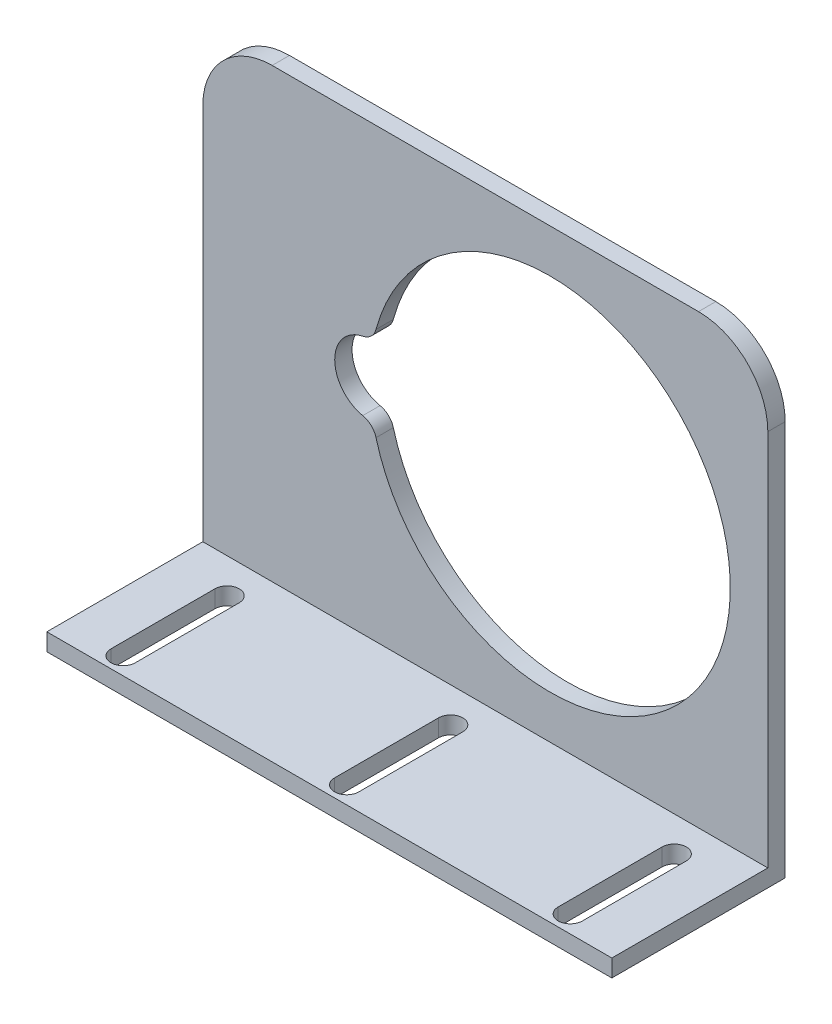
ISO-10303-21;
HEADER;
FILE_DESCRIPTION(('STEP AP214'),'2;1');
FILE_NAME('part.step','',(''),(''),'','','');
FILE_SCHEMA(('AUTOMOTIVE_DESIGN { 1 0 10303 214 1 1 1 1 }'));
ENDSEC;
DATA;
#1=APPLICATION_CONTEXT('core data for automotive mechanical design processes');
#2=APPLICATION_PROTOCOL_DEFINITION('international standard','automotive_design',2000,#1);
#3=PRODUCT_CONTEXT('',#1,'mechanical');
#4=PRODUCT('Part','Part','',(#3));
#5=PRODUCT_RELATED_PRODUCT_CATEGORY('part','',(#4));
#6=PRODUCT_DEFINITION_FORMATION('','',#4);
#7=PRODUCT_DEFINITION_CONTEXT('part definition',#1,'design');
#8=PRODUCT_DEFINITION('design','',#6,#7);
#9=PRODUCT_DEFINITION_SHAPE('','',#8);
#10=(LENGTH_UNIT() NAMED_UNIT(*) SI_UNIT(.MILLI.,.METRE.));
#11=(NAMED_UNIT(*) PLANE_ANGLE_UNIT() SI_UNIT($,.RADIAN.));
#12=(NAMED_UNIT(*) SI_UNIT($,.STERADIAN.) SOLID_ANGLE_UNIT());
#13=UNCERTAINTY_MEASURE_WITH_UNIT(LENGTH_MEASURE(1.E-05),#10,'distance_accuracy_value','');
#14=(GEOMETRIC_REPRESENTATION_CONTEXT(3) GLOBAL_UNCERTAINTY_ASSIGNED_CONTEXT((#13)) GLOBAL_UNIT_ASSIGNED_CONTEXT((#10,
#11,#12)) REPRESENTATION_CONTEXT('',''));
#15=CARTESIAN_POINT('',(0.,0.,0.));
#16=DIRECTION('',(0.,0.,1.));
#17=DIRECTION('',(1.,0.,0.));
#18=AXIS2_PLACEMENT_3D('',#15,#16,#17);
#19=CARTESIAN_POINT('',(0.,5.,0.));
#20=DIRECTION('',(0.,1.,0.));
#21=DIRECTION('',(0.,0.,1.));
#22=AXIS2_PLACEMENT_3D('',#19,#20,#21);
#23=PLANE('',#22);
#24=CARTESIAN_POINT('',(0.,5.,-10.));
#25=DIRECTION('',(0.,1.,0.));
#26=DIRECTION('',(0.,0.,1.));
#27=AXIS2_PLACEMENT_3D('',#24,#25,#26);
#28=CIRCLE('',#27,3.5);
#29=CARTESIAN_POINT('',(3.49999999999999,5.,-10.));
#30=VERTEX_POINT('',#29);
#31=CARTESIAN_POINT('',(-3.50000000000001,5.,-9.99999999999999));
#32=VERTEX_POINT('',#31);
#33=EDGE_CURVE('E59',#30,#32,#28,.T.);
#34=ORIENTED_EDGE('',*,*,#33,.F.);
#35=DIRECTION('',(0.,0.,-1.));
#36=VECTOR('',#35,1.);
#37=CARTESIAN_POINT('',(3.49999999999999,5.,-10.));
#38=LINE('',#37,#36);
#39=CARTESIAN_POINT('',(3.5,5.,20.));
#40=VERTEX_POINT('',#39);
#41=EDGE_CURVE('E225',#40,#30,#38,.T.);
#42=ORIENTED_EDGE('',*,*,#41,.F.);
#43=CARTESIAN_POINT('',(0.,5.,20.));
#44=DIRECTION('',(0.,1.,0.));
#45=DIRECTION('',(0.,0.,1.));
#46=AXIS2_PLACEMENT_3D('',#43,#44,#45);
#47=CIRCLE('',#46,3.5);
#48=CARTESIAN_POINT('',(-3.5,5.,20.));
#49=VERTEX_POINT('',#48);
#50=EDGE_CURVE('E229',#49,#40,#47,.T.);
#51=ORIENTED_EDGE('',*,*,#50,.F.);
#52=DIRECTION('',(0.,0.,1.));
#53=VECTOR('',#52,1.);
#54=CARTESIAN_POINT('',(-3.50000000000001,5.,-9.99999999999999));
#55=LINE('',#54,#53);
#56=EDGE_CURVE('E238',#32,#49,#55,.T.);
#57=ORIENTED_EDGE('',*,*,#56,.F.);
#58=EDGE_LOOP('',(#34,#42,#51,#57));
#59=FACE_BOUND('',#58,.T.);
#60=CARTESIAN_POINT('',(-64.5,5.,-9.99999999999999));
#61=DIRECTION('',(0.,1.,0.));
#62=DIRECTION('',(0.,0.,1.));
#63=AXIS2_PLACEMENT_3D('',#60,#61,#62);
#64=CIRCLE('',#63,3.5);
#65=CARTESIAN_POINT('',(-61.,5.,-9.99999999999999));
#66=VERTEX_POINT('',#65);
#67=CARTESIAN_POINT('',(-68.,5.,-9.99999999999999));
#68=VERTEX_POINT('',#67);
#69=EDGE_CURVE('E286',#66,#68,#64,.T.);
#70=ORIENTED_EDGE('',*,*,#69,.F.);
#71=DIRECTION('',(0.,0.,-1.));
#72=VECTOR('',#71,1.);
#73=CARTESIAN_POINT('',(-61.,5.,-9.99999999999999));
#74=LINE('',#73,#72);
#75=CARTESIAN_POINT('',(-61.,5.,20.));
#76=VERTEX_POINT('',#75);
#77=EDGE_CURVE('E301',#76,#66,#74,.T.);
#78=ORIENTED_EDGE('',*,*,#77,.F.);
#79=CARTESIAN_POINT('',(-64.5,5.,20.));
#80=DIRECTION('',(0.,1.,0.));
#81=DIRECTION('',(0.,0.,1.));
#82=AXIS2_PLACEMENT_3D('',#79,#80,#81);
#83=CIRCLE('',#82,3.5);
#84=CARTESIAN_POINT('',(-68.,5.,20.));
#85=VERTEX_POINT('',#84);
#86=EDGE_CURVE('E320',#85,#76,#83,.T.);
#87=ORIENTED_EDGE('',*,*,#86,.F.);
#88=DIRECTION('',(0.,0.,1.));
#89=VECTOR('',#88,1.);
#90=CARTESIAN_POINT('',(-68.,5.,-9.99999999999999));
#91=LINE('',#90,#89);
#92=EDGE_CURVE('E316',#68,#85,#91,.T.);
#93=ORIENTED_EDGE('',*,*,#92,.F.);
#94=EDGE_LOOP('',(#70,#78,#87,#93));
#95=FACE_BOUND('',#94,.T.);
#96=DIRECTION('',(1.,0.,0.));
#97=VECTOR('',#96,1.);
#98=CARTESIAN_POINT('',(-81.5,5.,-20.));
#99=LINE('',#98,#97);
#100=CARTESIAN_POINT('',(-81.5,5.,-20.));
#101=VERTEX_POINT('',#100);
#102=CARTESIAN_POINT('',(81.5,5.,-20.));
#103=VERTEX_POINT('',#102);
#104=EDGE_CURVE('E349',#101,#103,#99,.T.);
#105=ORIENTED_EDGE('',*,*,#104,.F.);
#106=DIRECTION('',(0.,0.,1.));
#107=VECTOR('',#106,1.);
#108=CARTESIAN_POINT('',(-81.5,5.,-25.));
#109=LINE('',#108,#107);
#110=CARTESIAN_POINT('',(-81.5,5.,25.));
#111=VERTEX_POINT('',#110);
#112=EDGE_CURVE('E378',#101,#111,#109,.T.);
#113=ORIENTED_EDGE('',*,*,#112,.T.);
#114=DIRECTION('',(1.,0.,0.));
#115=VECTOR('',#114,1.);
#116=CARTESIAN_POINT('',(-81.5,5.,25.));
#117=LINE('',#116,#115);
#118=CARTESIAN_POINT('',(81.5,5.,25.));
#119=VERTEX_POINT('',#118);
#120=EDGE_CURVE('E382',#111,#119,#117,.T.);
#121=ORIENTED_EDGE('',*,*,#120,.T.);
#122=DIRECTION('',(0.,0.,-1.));
#123=VECTOR('',#122,1.);
#124=CARTESIAN_POINT('',(81.5,5.,-25.));
#125=LINE('',#124,#123);
#126=EDGE_CURVE('E374',#119,#103,#125,.T.);
#127=ORIENTED_EDGE('',*,*,#126,.T.);
#128=EDGE_LOOP('',(#105,#113,#121,#127));
#129=FACE_BOUND('',#128,.T.);
#130=DIRECTION('',(0.,0.,-1.));
#131=VECTOR('',#130,1.);
#132=CARTESIAN_POINT('',(61.,5.,-9.99999999999999));
#133=LINE('',#132,#131);
#134=CARTESIAN_POINT('',(61.,5.,20.));
#135=VERTEX_POINT('',#134);
#136=CARTESIAN_POINT('',(61.,5.,-9.99999999999999));
#137=VERTEX_POINT('',#136);
#138=EDGE_CURVE('E271',#135,#137,#133,.T.);
#139=ORIENTED_EDGE('',*,*,#138,.T.);
#140=CARTESIAN_POINT('',(64.5,5.,-9.99999999999999));
#141=DIRECTION('',(0.,-1.,0.));
#142=DIRECTION('',(0.,0.,1.));
#143=AXIS2_PLACEMENT_3D('',#140,#141,#142);
#144=CIRCLE('',#143,3.5);
#145=CARTESIAN_POINT('',(68.,5.,-9.99999999999999));
#146=VERTEX_POINT('',#145);
#147=EDGE_CURVE('E247',#137,#146,#144,.T.);
#148=ORIENTED_EDGE('',*,*,#147,.T.);
#149=DIRECTION('',(0.,0.,1.));
#150=VECTOR('',#149,1.);
#151=CARTESIAN_POINT('',(68.,5.,-9.99999999999999));
#152=LINE('',#151,#150);
#153=CARTESIAN_POINT('',(68.,5.,20.));
#154=VERTEX_POINT('',#153);
#155=EDGE_CURVE('E257',#146,#154,#152,.T.);
#156=ORIENTED_EDGE('',*,*,#155,.T.);
#157=CARTESIAN_POINT('',(64.5,5.,20.));
#158=DIRECTION('',(0.,-1.,0.));
#159=DIRECTION('',(0.,0.,1.));
#160=AXIS2_PLACEMENT_3D('',#157,#158,#159);
#161=CIRCLE('',#160,3.5);
#162=EDGE_CURVE('E275',#154,#135,#161,.T.);
#163=ORIENTED_EDGE('',*,*,#162,.T.);
#164=EDGE_LOOP('',(#139,#148,#156,#163));
#165=FACE_BOUND('',#164,.T.);
#166=ADVANCED_FACE('F43',(#59,#95,#129,#165),#23,.T.);
#167=CARTESIAN_POINT('',(0.,0.,0.));
#168=DIRECTION('',(0.,1.,0.));
#169=DIRECTION('',(0.,0.,1.));
#170=AXIS2_PLACEMENT_3D('',#167,#168,#169);
#171=PLANE('',#170);
#172=DIRECTION('',(0.,0.,-1.));
#173=VECTOR('',#172,1.);
#174=CARTESIAN_POINT('',(3.49999999999999,0.,-10.));
#175=LINE('',#174,#173);
#176=CARTESIAN_POINT('',(3.5,0.,20.));
#177=VERTEX_POINT('',#176);
#178=CARTESIAN_POINT('',(3.49999999999999,0.,-10.));
#179=VERTEX_POINT('',#178);
#180=EDGE_CURVE('E213',#177,#179,#175,.T.);
#181=ORIENTED_EDGE('',*,*,#180,.T.);
#182=CARTESIAN_POINT('',(0.,0.,-10.));
#183=DIRECTION('',(0.,1.,0.));
#184=DIRECTION('',(0.,0.,1.));
#185=AXIS2_PLACEMENT_3D('',#182,#183,#184);
#186=CIRCLE('',#185,3.5);
#187=CARTESIAN_POINT('',(-3.50000000000001,0.,-9.99999999999999));
#188=VERTEX_POINT('',#187);
#189=EDGE_CURVE('E206',#179,#188,#186,.T.);
#190=ORIENTED_EDGE('',*,*,#189,.T.);
#191=DIRECTION('',(0.,0.,1.));
#192=VECTOR('',#191,1.);
#193=CARTESIAN_POINT('',(-3.50000000000001,0.,-9.99999999999999));
#194=LINE('',#193,#192);
#195=CARTESIAN_POINT('',(-3.5,0.,20.));
#196=VERTEX_POINT('',#195);
#197=EDGE_CURVE('E216',#188,#196,#194,.T.);
#198=ORIENTED_EDGE('',*,*,#197,.T.);
#199=CARTESIAN_POINT('',(0.,0.,20.));
#200=DIRECTION('',(0.,1.,0.));
#201=DIRECTION('',(0.,0.,1.));
#202=AXIS2_PLACEMENT_3D('',#199,#200,#201);
#203=CIRCLE('',#202,3.5);
#204=EDGE_CURVE('E67',#196,#177,#203,.T.);
#205=ORIENTED_EDGE('',*,*,#204,.T.);
#206=EDGE_LOOP('',(#181,#190,#198,#205));
#207=FACE_BOUND('',#206,.T.);
#208=DIRECTION('',(0.,0.,-1.));
#209=VECTOR('',#208,1.);
#210=CARTESIAN_POINT('',(81.5,0.,-25.));
#211=LINE('',#210,#209);
#212=CARTESIAN_POINT('',(81.5,0.,25.));
#213=VERTEX_POINT('',#212);
#214=CARTESIAN_POINT('',(81.5,0.,-25.));
#215=VERTEX_POINT('',#214);
#216=EDGE_CURVE('E373',#213,#215,#211,.T.);
#217=ORIENTED_EDGE('',*,*,#216,.F.);
#218=DIRECTION('',(1.,0.,0.));
#219=VECTOR('',#218,1.);
#220=CARTESIAN_POINT('',(-81.5,0.,25.));
#221=LINE('',#220,#219);
#222=CARTESIAN_POINT('',(-81.5,0.,25.));
#223=VERTEX_POINT('',#222);
#224=EDGE_CURVE('E379',#223,#213,#221,.T.);
#225=ORIENTED_EDGE('',*,*,#224,.F.);
#226=DIRECTION('',(0.,0.,1.));
#227=VECTOR('',#226,1.);
#228=CARTESIAN_POINT('',(-81.5,0.,-25.));
#229=LINE('',#228,#227);
#230=CARTESIAN_POINT('',(-81.5,0.,-25.));
#231=VERTEX_POINT('',#230);
#232=EDGE_CURVE('E393',#231,#223,#229,.T.);
#233=ORIENTED_EDGE('',*,*,#232,.F.);
#234=DIRECTION('',(-1.,0.,0.));
#235=VECTOR('',#234,1.);
#236=CARTESIAN_POINT('',(-81.5,0.,-25.));
#237=LINE('',#236,#235);
#238=EDGE_CURVE('E389',#215,#231,#237,.T.);
#239=ORIENTED_EDGE('',*,*,#238,.F.);
#240=EDGE_LOOP('',(#217,#225,#233,#239));
#241=FACE_BOUND('',#240,.T.);
#242=DIRECTION('',(0.,0.,-1.));
#243=VECTOR('',#242,1.);
#244=CARTESIAN_POINT('',(-61.,0.,-9.99999999999999));
#245=LINE('',#244,#243);
#246=CARTESIAN_POINT('',(-61.,0.,20.));
#247=VERTEX_POINT('',#246);
#248=CARTESIAN_POINT('',(-61.,0.,-9.99999999999999));
#249=VERTEX_POINT('',#248);
#250=EDGE_CURVE('E309',#247,#249,#245,.T.);
#251=ORIENTED_EDGE('',*,*,#250,.T.);
#252=CARTESIAN_POINT('',(-64.5,0.,-9.99999999999999));
#253=DIRECTION('',(0.,1.,0.));
#254=DIRECTION('',(0.,0.,1.));
#255=AXIS2_PLACEMENT_3D('',#252,#253,#254);
#256=CIRCLE('',#255,3.5);
#257=CARTESIAN_POINT('',(-68.,0.,-9.99999999999999));
#258=VERTEX_POINT('',#257);
#259=EDGE_CURVE('E296',#249,#258,#256,.T.);
#260=ORIENTED_EDGE('',*,*,#259,.T.);
#261=DIRECTION('',(0.,0.,1.));
#262=VECTOR('',#261,1.);
#263=CARTESIAN_POINT('',(-68.,0.,-9.99999999999999));
#264=LINE('',#263,#262);
#265=CARTESIAN_POINT('',(-68.,0.,20.));
#266=VERTEX_POINT('',#265);
#267=EDGE_CURVE('E300',#258,#266,#264,.T.);
#268=ORIENTED_EDGE('',*,*,#267,.T.);
#269=CARTESIAN_POINT('',(-64.5,0.,20.));
#270=DIRECTION('',(0.,1.,0.));
#271=DIRECTION('',(0.,0.,1.));
#272=AXIS2_PLACEMENT_3D('',#269,#270,#271);
#273=CIRCLE('',#272,3.5);
#274=EDGE_CURVE('E305',#266,#247,#273,.T.);
#275=ORIENTED_EDGE('',*,*,#274,.T.);
#276=EDGE_LOOP('',(#251,#260,#268,#275));
#277=FACE_BOUND('',#276,.T.);
#278=CARTESIAN_POINT('',(64.5,0.,-9.99999999999999));
#279=DIRECTION('',(0.,-1.,0.));
#280=DIRECTION('',(0.,0.,1.));
#281=AXIS2_PLACEMENT_3D('',#278,#279,#280);
#282=CIRCLE('',#281,3.5);
#283=CARTESIAN_POINT('',(61.,0.,-9.99999999999999));
#284=VERTEX_POINT('',#283);
#285=CARTESIAN_POINT('',(68.,0.,-9.99999999999999));
#286=VERTEX_POINT('',#285);
#287=EDGE_CURVE('E253',#284,#286,#282,.T.);
#288=ORIENTED_EDGE('',*,*,#287,.F.);
#289=DIRECTION('',(0.,0.,-1.));
#290=VECTOR('',#289,1.);
#291=CARTESIAN_POINT('',(61.,0.,-9.99999999999999));
#292=LINE('',#291,#290);
#293=CARTESIAN_POINT('',(61.,0.,20.));
#294=VERTEX_POINT('',#293);
#295=EDGE_CURVE('E256',#294,#284,#292,.T.);
#296=ORIENTED_EDGE('',*,*,#295,.F.);
#297=CARTESIAN_POINT('',(64.5,0.,20.));
#298=DIRECTION('',(0.,-1.,0.));
#299=DIRECTION('',(0.,0.,1.));
#300=AXIS2_PLACEMENT_3D('',#297,#298,#299);
#301=CIRCLE('',#300,3.5);
#302=CARTESIAN_POINT('',(68.,0.,20.));
#303=VERTEX_POINT('',#302);
#304=EDGE_CURVE('E260',#303,#294,#301,.T.);
#305=ORIENTED_EDGE('',*,*,#304,.F.);
#306=DIRECTION('',(0.,0.,1.));
#307=VECTOR('',#306,1.);
#308=CARTESIAN_POINT('',(68.,0.,-9.99999999999999));
#309=LINE('',#308,#307);
#310=EDGE_CURVE('E264',#286,#303,#309,.T.);
#311=ORIENTED_EDGE('',*,*,#310,.F.);
#312=EDGE_LOOP('',(#288,#296,#305,#311));
#313=FACE_BOUND('',#312,.T.);
#314=ADVANCED_FACE('F221',(#207,#241,#277,#313),#171,.F.);
#315=CARTESIAN_POINT('',(81.5,5.,-25.));
#316=DIRECTION('',(-1.,0.,0.));
#317=DIRECTION('',(0.,0.,1.));
#318=AXIS2_PLACEMENT_3D('',#315,#316,#317);
#319=PLANE('',#318);
#320=DIRECTION('',(0.,-1.,0.));
#321=VECTOR('',#320,1.);
#322=CARTESIAN_POINT('',(81.5,5.,-25.));
#323=LINE('',#322,#321);
#324=CARTESIAN_POINT('',(81.5,114.,-25.));
#325=VERTEX_POINT('',#324);
#326=EDGE_CURVE('E408',#325,#215,#323,.T.);
#327=ORIENTED_EDGE('',*,*,#326,.F.);
#328=DIRECTION('',(0.,0.,-1.));
#329=VECTOR('',#328,1.);
#330=CARTESIAN_POINT('',(81.5,114.,-20.));
#331=LINE('',#330,#329);
#332=CARTESIAN_POINT('',(81.5,114.,-20.));
#333=VERTEX_POINT('',#332);
#334=EDGE_CURVE('E11',#325,#333,#331,.F.);
#335=ORIENTED_EDGE('',*,*,#334,.T.);
#336=DIRECTION('',(0.,-1.,0.));
#337=VECTOR('',#336,1.);
#338=CARTESIAN_POINT('',(81.5,134.,-20.));
#339=LINE('',#338,#337);
#340=EDGE_CURVE('E364',#333,#103,#339,.T.);
#341=ORIENTED_EDGE('',*,*,#340,.T.);
#342=ORIENTED_EDGE('',*,*,#126,.F.);
#343=DIRECTION('',(0.,-1.,0.));
#344=VECTOR('',#343,1.);
#345=CARTESIAN_POINT('',(81.5,5.,25.));
#346=LINE('',#345,#344);
#347=EDGE_CURVE('E385',#119,#213,#346,.T.);
#348=ORIENTED_EDGE('',*,*,#347,.T.);
#349=ORIENTED_EDGE('',*,*,#216,.T.);
#350=EDGE_LOOP('',(#327,#335,#341,#342,#348,#349));
#351=FACE_BOUND('',#350,.T.);
#352=ADVANCED_FACE('F490',(#351),#319,.F.);
#353=CARTESIAN_POINT('',(-81.5,5.,-25.));
#354=DIRECTION('',(0.,0.,1.));
#355=DIRECTION('',(1.,0.,0.));
#356=AXIS2_PLACEMENT_3D('',#353,#354,#355);
#357=PLANE('',#356);
#358=CARTESIAN_POINT('',(-33.3257207501741,69.5,-25.));
#359=DIRECTION('',(0.,0.,1.));
#360=DIRECTION('',(1.,0.,0.));
#361=AXIS2_PLACEMENT_3D('',#358,#359,#360);
#362=CIRCLE('',#361,10.1265641269913);
#363=CARTESIAN_POINT('',(-35.361040160378,79.4199181406156,-25.));
#364=VERTEX_POINT('',#363);
#365=CARTESIAN_POINT('',(-35.361040160378,59.5800818593844,-25.));
#366=VERTEX_POINT('',#365);
#367=EDGE_CURVE('E340',#364,#366,#362,.T.);
#368=ORIENTED_EDGE('',*,*,#367,.T.);
#369=CARTESIAN_POINT('',(-36.365980920482,54.682113498045,-25.));
#370=DIRECTION('',(0.,0.,1.));
#371=DIRECTION('',(1.,0.,0.));
#372=AXIS2_PLACEMENT_3D('',#369,#370,#371);
#373=CIRCLE('',#372,5.);
#374=CARTESIAN_POINT('',(-31.5378879230865,55.9819281034797,-25.));
#375=VERTEX_POINT('',#374);
#376=EDGE_CURVE('E434',#366,#375,#373,.F.);
#377=ORIENTED_EDGE('',*,*,#376,.T.);
#378=CARTESIAN_POINT('',(18.6742792498259,69.5,-25.));
#379=DIRECTION('',(0.,0.,1.));
#380=DIRECTION('',(1.,0.,0.));
#381=AXIS2_PLACEMENT_3D('',#378,#379,#380);
#382=CIRCLE('',#381,52.);
#383=CARTESIAN_POINT('',(-31.5378879230866,83.0180718965203,-25.));
#384=VERTEX_POINT('',#383);
#385=EDGE_CURVE('E344',#375,#384,#382,.T.);
#386=ORIENTED_EDGE('',*,*,#385,.T.);
#387=CARTESIAN_POINT('',(-36.365980920482,84.317886501955,-25.));
#388=DIRECTION('',(0.,0.,1.));
#389=DIRECTION('',(1.,0.,0.));
#390=AXIS2_PLACEMENT_3D('',#387,#388,#389);
#391=CIRCLE('',#390,5.);
#392=EDGE_CURVE('E431',#384,#364,#391,.F.);
#393=ORIENTED_EDGE('',*,*,#392,.T.);
#394=EDGE_LOOP('',(#368,#377,#386,#393));
#395=FACE_BOUND('',#394,.T.);
#396=DIRECTION('',(0.,-1.,0.));
#397=VECTOR('',#396,1.);
#398=CARTESIAN_POINT('',(-81.5,5.,-25.));
#399=LINE('',#398,#397);
#400=CARTESIAN_POINT('',(-81.5,114.,-25.));
#401=VERTEX_POINT('',#400);
#402=EDGE_CURVE('E405',#401,#231,#399,.T.);
#403=ORIENTED_EDGE('',*,*,#402,.F.);
#404=CARTESIAN_POINT('',(-61.5,114.,-25.));
#405=DIRECTION('',(0.,0.,1.));
#406=DIRECTION('',(1.,0.,0.));
#407=AXIS2_PLACEMENT_3D('',#404,#405,#406);
#408=CIRCLE('',#407,20.);
#409=CARTESIAN_POINT('',(-61.5,134.,-25.));
#410=VERTEX_POINT('',#409);
#411=EDGE_CURVE('E52',#401,#410,#408,.F.);
#412=ORIENTED_EDGE('',*,*,#411,.T.);
#413=DIRECTION('',(-1.,0.,0.));
#414=VECTOR('',#413,1.);
#415=CARTESIAN_POINT('',(-81.5,134.,-25.));
#416=LINE('',#415,#414);
#417=CARTESIAN_POINT('',(61.5,134.,-25.));
#418=VERTEX_POINT('',#417);
#419=EDGE_CURVE('E360',#418,#410,#416,.T.);
#420=ORIENTED_EDGE('',*,*,#419,.F.);
#421=CARTESIAN_POINT('',(61.5,114.,-25.));
#422=DIRECTION('',(0.,0.,1.));
#423=DIRECTION('',(1.,0.,0.));
#424=AXIS2_PLACEMENT_3D('',#421,#422,#423);
#425=CIRCLE('',#424,20.);
#426=EDGE_CURVE('E454',#418,#325,#425,.F.);
#427=ORIENTED_EDGE('',*,*,#426,.T.);
#428=ORIENTED_EDGE('',*,*,#326,.T.);
#429=ORIENTED_EDGE('',*,*,#238,.T.);
#430=EDGE_LOOP('',(#403,#412,#420,#427,#428,#429));
#431=FACE_BOUND('',#430,.T.);
#432=ADVANCED_FACE('F461',(#395,#431),#357,.F.);
#433=CARTESIAN_POINT('',(-81.5,5.,-25.));
#434=DIRECTION('',(1.,0.,0.));
#435=DIRECTION('',(0.,0.,-1.));
#436=AXIS2_PLACEMENT_3D('',#433,#434,#435);
#437=PLANE('',#436);
#438=DIRECTION('',(0.,-1.,0.));
#439=VECTOR('',#438,1.);
#440=CARTESIAN_POINT('',(-81.5,134.,-20.));
#441=LINE('',#440,#439);
#442=CARTESIAN_POINT('',(-81.5,114.,-20.));
#443=VERTEX_POINT('',#442);
#444=EDGE_CURVE('E370',#443,#101,#441,.T.);
#445=ORIENTED_EDGE('',*,*,#444,.F.);
#446=DIRECTION('',(0.,0.,1.));
#447=VECTOR('',#446,1.);
#448=CARTESIAN_POINT('',(-81.5,114.,-25.));
#449=LINE('',#448,#447);
#450=EDGE_CURVE('E451',#443,#401,#449,.F.);
#451=ORIENTED_EDGE('',*,*,#450,.T.);
#452=ORIENTED_EDGE('',*,*,#402,.T.);
#453=ORIENTED_EDGE('',*,*,#232,.T.);
#454=DIRECTION('',(0.,-1.,0.));
#455=VECTOR('',#454,1.);
#456=CARTESIAN_POINT('',(-81.5,5.,25.));
#457=LINE('',#456,#455);
#458=EDGE_CURVE('E401',#111,#223,#457,.T.);
#459=ORIENTED_EDGE('',*,*,#458,.F.);
#460=ORIENTED_EDGE('',*,*,#112,.F.);
#461=EDGE_LOOP('',(#445,#451,#452,#453,#459,#460));
#462=FACE_BOUND('',#461,.T.);
#463=ADVANCED_FACE('F476',(#462),#437,.F.);
#464=CARTESIAN_POINT('',(-81.5,5.,25.));
#465=DIRECTION('',(0.,0.,-1.));
#466=DIRECTION('',(-1.,0.,0.));
#467=AXIS2_PLACEMENT_3D('',#464,#465,#466);
#468=PLANE('',#467);
#469=ORIENTED_EDGE('',*,*,#224,.T.);
#470=ORIENTED_EDGE('',*,*,#347,.F.);
#471=ORIENTED_EDGE('',*,*,#120,.F.);
#472=ORIENTED_EDGE('',*,*,#458,.T.);
#473=EDGE_LOOP('',(#469,#470,#471,#472));
#474=FACE_BOUND('',#473,.T.);
#475=ADVANCED_FACE('F496',(#474),#468,.F.);
#476=CARTESIAN_POINT('',(-81.5,134.,-20.));
#477=DIRECTION('',(0.,0.,-1.));
#478=DIRECTION('',(-1.,0.,0.));
#479=AXIS2_PLACEMENT_3D('',#476,#477,#478);
#480=PLANE('',#479);
#481=CARTESIAN_POINT('',(18.6742792498259,69.5,-20.));
#482=DIRECTION('',(0.,0.,1.));
#483=DIRECTION('',(1.,0.,0.));
#484=AXIS2_PLACEMENT_3D('',#481,#482,#483);
#485=CIRCLE('',#484,52.);
#486=CARTESIAN_POINT('',(-31.5378879230865,55.9819281034797,-20.));
#487=VERTEX_POINT('',#486);
#488=CARTESIAN_POINT('',(-31.5378879230866,83.0180718965203,-20.));
#489=VERTEX_POINT('',#488);
#490=EDGE_CURVE('E345',#487,#489,#485,.T.);
#491=ORIENTED_EDGE('',*,*,#490,.F.);
#492=CARTESIAN_POINT('',(-36.365980920482,54.682113498045,-20.));
#493=DIRECTION('',(0.,0.,-1.));
#494=DIRECTION('',(-1.,0.,0.));
#495=AXIS2_PLACEMENT_3D('',#492,#493,#494);
#496=CIRCLE('',#495,5.);
#497=CARTESIAN_POINT('',(-35.361040160378,59.5800818593844,-20.));
#498=VERTEX_POINT('',#497);
#499=EDGE_CURVE('E421',#487,#498,#496,.F.);
#500=ORIENTED_EDGE('',*,*,#499,.T.);
#501=CARTESIAN_POINT('',(-33.3257207501741,69.5,-20.));
#502=DIRECTION('',(0.,0.,1.));
#503=DIRECTION('',(1.,0.,0.));
#504=AXIS2_PLACEMENT_3D('',#501,#502,#503);
#505=CIRCLE('',#504,10.1265641269913);
#506=CARTESIAN_POINT('',(-35.361040160378,79.4199181406156,-20.));
#507=VERTEX_POINT('',#506);
#508=EDGE_CURVE('E330',#507,#498,#505,.T.);
#509=ORIENTED_EDGE('',*,*,#508,.F.);
#510=CARTESIAN_POINT('',(-36.365980920482,84.317886501955,-20.));
#511=DIRECTION('',(0.,0.,-1.));
#512=DIRECTION('',(-1.,0.,0.));
#513=AXIS2_PLACEMENT_3D('',#510,#511,#512);
#514=CIRCLE('',#513,5.);
#515=EDGE_CURVE('E418',#507,#489,#514,.F.);
#516=ORIENTED_EDGE('',*,*,#515,.T.);
#517=EDGE_LOOP('',(#491,#500,#509,#516));
#518=FACE_BOUND('',#517,.T.);
#519=DIRECTION('',(1.,0.,0.));
#520=VECTOR('',#519,1.);
#521=CARTESIAN_POINT('',(-81.5,134.,-20.));
#522=LINE('',#521,#520);
#523=CARTESIAN_POINT('',(-61.5,134.,-20.));
#524=VERTEX_POINT('',#523);
#525=CARTESIAN_POINT('',(61.5,134.,-20.));
#526=VERTEX_POINT('',#525);
#527=EDGE_CURVE('E356',#524,#526,#522,.T.);
#528=ORIENTED_EDGE('',*,*,#527,.F.);
#529=CARTESIAN_POINT('',(-61.5,114.,-20.));
#530=DIRECTION('',(0.,0.,-1.));
#531=DIRECTION('',(-1.,0.,0.));
#532=AXIS2_PLACEMENT_3D('',#529,#530,#531);
#533=CIRCLE('',#532,20.);
#534=EDGE_CURVE('E448',#524,#443,#533,.F.);
#535=ORIENTED_EDGE('',*,*,#534,.T.);
#536=ORIENTED_EDGE('',*,*,#444,.T.);
#537=ORIENTED_EDGE('',*,*,#104,.T.);
#538=ORIENTED_EDGE('',*,*,#340,.F.);
#539=CARTESIAN_POINT('',(61.5,114.,-20.));
#540=DIRECTION('',(0.,0.,-1.));
#541=DIRECTION('',(-1.,0.,0.));
#542=AXIS2_PLACEMENT_3D('',#539,#540,#541);
#543=CIRCLE('',#542,20.);
#544=EDGE_CURVE('E445',#333,#526,#543,.F.);
#545=ORIENTED_EDGE('',*,*,#544,.T.);
#546=EDGE_LOOP('',(#528,#535,#536,#537,#538,#545));
#547=FACE_BOUND('',#546,.T.);
#548=ADVANCED_FACE('F472',(#518,#547),#480,.F.);
#549=CARTESIAN_POINT('',(0.,134.,0.));
#550=DIRECTION('',(0.,1.,0.));
#551=DIRECTION('',(0.,0.,1.));
#552=AXIS2_PLACEMENT_3D('',#549,#550,#551);
#553=PLANE('',#552);
#554=ORIENTED_EDGE('',*,*,#419,.T.);
#555=DIRECTION('',(0.,0.,1.));
#556=VECTOR('',#555,1.);
#557=CARTESIAN_POINT('',(-61.5,134.,-20.));
#558=LINE('',#557,#556);
#559=EDGE_CURVE('E441',#410,#524,#558,.T.);
#560=ORIENTED_EDGE('',*,*,#559,.T.);
#561=ORIENTED_EDGE('',*,*,#527,.T.);
#562=DIRECTION('',(0.,0.,-1.));
#563=VECTOR('',#562,1.);
#564=CARTESIAN_POINT('',(61.5,134.,-25.));
#565=LINE('',#564,#563);
#566=EDGE_CURVE('E437',#526,#418,#565,.T.);
#567=ORIENTED_EDGE('',*,*,#566,.T.);
#568=EDGE_LOOP('',(#554,#560,#561,#567));
#569=FACE_BOUND('',#568,.T.);
#570=ADVANCED_FACE('F466',(#569),#553,.T.);
#571=CARTESIAN_POINT('',(-33.3257207501741,69.5,-25.));
#572=DIRECTION('',(0.,0.,1.));
#573=DIRECTION('',(1.,0.,0.));
#574=AXIS2_PLACEMENT_3D('',#571,#572,#573);
#575=CYLINDRICAL_SURFACE('',#574,10.1265641269913);
#576=ORIENTED_EDGE('',*,*,#508,.T.);
#577=DIRECTION('',(0.,0.,1.));
#578=VECTOR('',#577,1.);
#579=CARTESIAN_POINT('',(-35.361040160378,59.5800818593844,-25.));
#580=LINE('',#579,#578);
#581=EDGE_CURVE('E428',#498,#366,#580,.F.);
#582=ORIENTED_EDGE('',*,*,#581,.T.);
#583=ORIENTED_EDGE('',*,*,#367,.F.);
#584=DIRECTION('',(0.,0.,1.));
#585=VECTOR('',#584,1.);
#586=CARTESIAN_POINT('',(-35.361040160378,79.4199181406156,-25.));
#587=LINE('',#586,#585);
#588=EDGE_CURVE('E424',#364,#507,#587,.T.);
#589=ORIENTED_EDGE('',*,*,#588,.T.);
#590=EDGE_LOOP('',(#576,#582,#583,#589));
#591=FACE_BOUND('',#590,.T.);
#592=ADVANCED_FACE('F519',(#591),#575,.F.);
#593=CARTESIAN_POINT('',(18.6742792498259,69.5,-25.));
#594=DIRECTION('',(0.,0.,1.));
#595=DIRECTION('',(1.,0.,0.));
#596=AXIS2_PLACEMENT_3D('',#593,#594,#595);
#597=CYLINDRICAL_SURFACE('',#596,52.);
#598=ORIENTED_EDGE('',*,*,#385,.F.);
#599=DIRECTION('',(0.,0.,1.));
#600=VECTOR('',#599,1.);
#601=CARTESIAN_POINT('',(-31.5378879230866,55.9819281034797,-25.));
#602=LINE('',#601,#600);
#603=EDGE_CURVE('E414',#375,#487,#602,.T.);
#604=ORIENTED_EDGE('',*,*,#603,.T.);
#605=ORIENTED_EDGE('',*,*,#490,.T.);
#606=DIRECTION('',(0.,0.,1.));
#607=VECTOR('',#606,1.);
#608=CARTESIAN_POINT('',(-31.5378879230866,83.0180718965203,-25.));
#609=LINE('',#608,#607);
#610=EDGE_CURVE('E411',#489,#384,#609,.F.);
#611=ORIENTED_EDGE('',*,*,#610,.T.);
#612=EDGE_LOOP('',(#598,#604,#605,#611));
#613=FACE_BOUND('',#612,.T.);
#614=ADVANCED_FACE('F522',(#613),#597,.F.);
#615=CARTESIAN_POINT('',(-36.365980920482,54.682113498045,-25.));
#616=DIRECTION('',(0.,0.,1.));
#617=DIRECTION('',(1.,0.,0.));
#618=AXIS2_PLACEMENT_3D('',#615,#616,#617);
#619=CYLINDRICAL_SURFACE('',#618,5.);
#620=ORIENTED_EDGE('',*,*,#376,.F.);
#621=ORIENTED_EDGE('',*,*,#581,.F.);
#622=ORIENTED_EDGE('',*,*,#499,.F.);
#623=ORIENTED_EDGE('',*,*,#603,.F.);
#624=EDGE_LOOP('',(#620,#621,#622,#623));
#625=FACE_BOUND('',#624,.T.);
#626=ADVANCED_FACE('F526',(#625),#619,.T.);
#627=CARTESIAN_POINT('',(-36.365980920482,84.317886501955,-25.));
#628=DIRECTION('',(0.,0.,1.));
#629=DIRECTION('',(1.,0.,0.));
#630=AXIS2_PLACEMENT_3D('',#627,#628,#629);
#631=CYLINDRICAL_SURFACE('',#630,5.);
#632=ORIENTED_EDGE('',*,*,#392,.F.);
#633=ORIENTED_EDGE('',*,*,#610,.F.);
#634=ORIENTED_EDGE('',*,*,#515,.F.);
#635=ORIENTED_EDGE('',*,*,#588,.F.);
#636=EDGE_LOOP('',(#632,#633,#634,#635));
#637=FACE_BOUND('',#636,.T.);
#638=ADVANCED_FACE('F687',(#637),#631,.T.);
#639=CARTESIAN_POINT('',(-61.5,114.,0.));
#640=DIRECTION('',(0.,0.,-1.));
#641=DIRECTION('',(-1.,0.,0.));
#642=AXIS2_PLACEMENT_3D('',#639,#640,#641);
#643=CYLINDRICAL_SURFACE('',#642,20.);
#644=ORIENTED_EDGE('',*,*,#411,.F.);
#645=ORIENTED_EDGE('',*,*,#450,.F.);
#646=ORIENTED_EDGE('',*,*,#534,.F.);
#647=ORIENTED_EDGE('',*,*,#559,.F.);
#648=EDGE_LOOP('',(#644,#645,#646,#647));
#649=FACE_BOUND('',#648,.T.);
#650=ADVANCED_FACE('F469',(#649),#643,.T.);
#651=CARTESIAN_POINT('',(61.5,114.,0.));
#652=DIRECTION('',(0.,0.,1.));
#653=DIRECTION('',(1.,0.,0.));
#654=AXIS2_PLACEMENT_3D('',#651,#652,#653);
#655=CYLINDRICAL_SURFACE('',#654,20.);
#656=ORIENTED_EDGE('',*,*,#544,.F.);
#657=ORIENTED_EDGE('',*,*,#334,.F.);
#658=ORIENTED_EDGE('',*,*,#426,.F.);
#659=ORIENTED_EDGE('',*,*,#566,.F.);
#660=EDGE_LOOP('',(#656,#657,#658,#659));
#661=FACE_BOUND('',#660,.T.);
#662=ADVANCED_FACE('F45',(#661),#655,.T.);
#663=CARTESIAN_POINT('',(-64.5,0.,-9.99999999999999));
#664=DIRECTION('',(0.,1.,0.));
#665=DIRECTION('',(0.,0.,1.));
#666=AXIS2_PLACEMENT_3D('',#663,#664,#665);
#667=CYLINDRICAL_SURFACE('',#666,3.5);
#668=ORIENTED_EDGE('',*,*,#69,.T.);
#669=DIRECTION('',(0.,1.,0.));
#670=VECTOR('',#669,1.);
#671=CARTESIAN_POINT('',(-68.,0.,-9.99999999999999));
#672=LINE('',#671,#670);
#673=EDGE_CURVE('E313',#258,#68,#672,.T.);
#674=ORIENTED_EDGE('',*,*,#673,.F.);
#675=ORIENTED_EDGE('',*,*,#259,.F.);
#676=DIRECTION('',(0.,1.,0.));
#677=VECTOR('',#676,1.);
#678=CARTESIAN_POINT('',(-61.,0.,-9.99999999999999));
#679=LINE('',#678,#677);
#680=EDGE_CURVE('E327',#249,#66,#679,.T.);
#681=ORIENTED_EDGE('',*,*,#680,.T.);
#682=EDGE_LOOP('',(#668,#674,#675,#681));
#683=FACE_BOUND('',#682,.T.);
#684=ADVANCED_FACE('F528',(#683),#667,.F.);
#685=CARTESIAN_POINT('',(-61.,0.,-9.99999999999999));
#686=DIRECTION('',(1.,0.,0.));
#687=DIRECTION('',(0.,0.,-1.));
#688=AXIS2_PLACEMENT_3D('',#685,#686,#687);
#689=PLANE('',#688);
#690=ORIENTED_EDGE('',*,*,#77,.T.);
#691=ORIENTED_EDGE('',*,*,#680,.F.);
#692=ORIENTED_EDGE('',*,*,#250,.F.);
#693=DIRECTION('',(0.,1.,0.));
#694=VECTOR('',#693,1.);
#695=CARTESIAN_POINT('',(-61.,0.,20.));
#696=LINE('',#695,#694);
#697=EDGE_CURVE('E331',#247,#76,#696,.T.);
#698=ORIENTED_EDGE('',*,*,#697,.T.);
#699=EDGE_LOOP('',(#690,#691,#692,#698));
#700=FACE_BOUND('',#699,.T.);
#701=ADVANCED_FACE('F531',(#700),#689,.F.);
#702=CARTESIAN_POINT('',(-64.5,0.,20.));
#703=DIRECTION('',(0.,1.,0.));
#704=DIRECTION('',(0.,0.,1.));
#705=AXIS2_PLACEMENT_3D('',#702,#703,#704);
#706=CYLINDRICAL_SURFACE('',#705,3.5);
#707=ORIENTED_EDGE('',*,*,#86,.T.);
#708=ORIENTED_EDGE('',*,*,#697,.F.);
#709=ORIENTED_EDGE('',*,*,#274,.F.);
#710=DIRECTION('',(0.,1.,0.));
#711=VECTOR('',#710,1.);
#712=CARTESIAN_POINT('',(-68.,0.,20.));
#713=LINE('',#712,#711);
#714=EDGE_CURVE('E334',#266,#85,#713,.T.);
#715=ORIENTED_EDGE('',*,*,#714,.T.);
#716=EDGE_LOOP('',(#707,#708,#709,#715));
#717=FACE_BOUND('',#716,.T.);
#718=ADVANCED_FACE('F537',(#717),#706,.F.);
#719=CARTESIAN_POINT('',(-68.,0.,-9.99999999999999));
#720=DIRECTION('',(-1.,0.,0.));
#721=DIRECTION('',(0.,0.,1.));
#722=AXIS2_PLACEMENT_3D('',#719,#720,#721);
#723=PLANE('',#722);
#724=ORIENTED_EDGE('',*,*,#92,.T.);
#725=ORIENTED_EDGE('',*,*,#714,.F.);
#726=ORIENTED_EDGE('',*,*,#267,.F.);
#727=ORIENTED_EDGE('',*,*,#673,.T.);
#728=EDGE_LOOP('',(#724,#725,#726,#727));
#729=FACE_BOUND('',#728,.T.);
#730=ADVANCED_FACE('F533',(#729),#723,.F.);
#731=CARTESIAN_POINT('',(64.5,0.,-9.99999999999999));
#732=DIRECTION('',(0.,1.,0.));
#733=DIRECTION('',(0.,0.,1.));
#734=AXIS2_PLACEMENT_3D('',#731,#732,#733);
#735=CYLINDRICAL_SURFACE('',#734,3.5);
#736=ORIENTED_EDGE('',*,*,#147,.F.);
#737=DIRECTION('',(0.,1.,0.));
#738=VECTOR('',#737,1.);
#739=CARTESIAN_POINT('',(61.,0.,-9.99999999999999));
#740=LINE('',#739,#738);
#741=EDGE_CURVE('E267',#284,#137,#740,.T.);
#742=ORIENTED_EDGE('',*,*,#741,.F.);
#743=ORIENTED_EDGE('',*,*,#287,.T.);
#744=DIRECTION('',(0.,1.,0.));
#745=VECTOR('',#744,1.);
#746=CARTESIAN_POINT('',(68.,0.,-9.99999999999999));
#747=LINE('',#746,#745);
#748=EDGE_CURVE('E282',#286,#146,#747,.T.);
#749=ORIENTED_EDGE('',*,*,#748,.T.);
#750=EDGE_LOOP('',(#736,#742,#743,#749));
#751=FACE_BOUND('',#750,.T.);
#752=ADVANCED_FACE('F536',(#751),#735,.F.);
#753=CARTESIAN_POINT('',(68.,0.,-9.99999999999999));
#754=DIRECTION('',(-1.,0.,0.));
#755=DIRECTION('',(0.,0.,1.));
#756=AXIS2_PLACEMENT_3D('',#753,#754,#755);
#757=PLANE('',#756);
#758=ORIENTED_EDGE('',*,*,#155,.F.);
#759=ORIENTED_EDGE('',*,*,#748,.F.);
#760=ORIENTED_EDGE('',*,*,#310,.T.);
#761=DIRECTION('',(0.,1.,0.));
#762=VECTOR('',#761,1.);
#763=CARTESIAN_POINT('',(68.,0.,20.));
#764=LINE('',#763,#762);
#765=EDGE_CURVE('E287',#303,#154,#764,.T.);
#766=ORIENTED_EDGE('',*,*,#765,.T.);
#767=EDGE_LOOP('',(#758,#759,#760,#766));
#768=FACE_BOUND('',#767,.T.);
#769=ADVANCED_FACE('F547',(#768),#757,.T.);
#770=CARTESIAN_POINT('',(64.5,0.,20.));
#771=DIRECTION('',(0.,1.,0.));
#772=DIRECTION('',(0.,0.,1.));
#773=AXIS2_PLACEMENT_3D('',#770,#771,#772);
#774=CYLINDRICAL_SURFACE('',#773,3.5);
#775=ORIENTED_EDGE('',*,*,#162,.F.);
#776=ORIENTED_EDGE('',*,*,#765,.F.);
#777=ORIENTED_EDGE('',*,*,#304,.T.);
#778=DIRECTION('',(0.,1.,0.));
#779=VECTOR('',#778,1.);
#780=CARTESIAN_POINT('',(61.,0.,20.));
#781=LINE('',#780,#779);
#782=EDGE_CURVE('E290',#294,#135,#781,.T.);
#783=ORIENTED_EDGE('',*,*,#782,.T.);
#784=EDGE_LOOP('',(#775,#776,#777,#783));
#785=FACE_BOUND('',#784,.T.);
#786=ADVANCED_FACE('F552',(#785),#774,.F.);
#787=CARTESIAN_POINT('',(61.,0.,-9.99999999999999));
#788=DIRECTION('',(1.,0.,0.));
#789=DIRECTION('',(0.,0.,-1.));
#790=AXIS2_PLACEMENT_3D('',#787,#788,#789);
#791=PLANE('',#790);
#792=ORIENTED_EDGE('',*,*,#138,.F.);
#793=ORIENTED_EDGE('',*,*,#782,.F.);
#794=ORIENTED_EDGE('',*,*,#295,.T.);
#795=ORIENTED_EDGE('',*,*,#741,.T.);
#796=EDGE_LOOP('',(#792,#793,#794,#795));
#797=FACE_BOUND('',#796,.T.);
#798=ADVANCED_FACE('F549',(#797),#791,.T.);
#799=CARTESIAN_POINT('',(0.,0.,-10.));
#800=DIRECTION('',(0.,1.,0.));
#801=DIRECTION('',(0.,0.,1.));
#802=AXIS2_PLACEMENT_3D('',#799,#800,#801);
#803=CYLINDRICAL_SURFACE('',#802,3.5);
#804=ORIENTED_EDGE('',*,*,#33,.T.);
#805=DIRECTION('',(0.,1.,0.));
#806=VECTOR('',#805,1.);
#807=CARTESIAN_POINT('',(-3.50000000000001,0.,-9.99999999999999));
#808=LINE('',#807,#806);
#809=EDGE_CURVE('E202',#188,#32,#808,.T.);
#810=ORIENTED_EDGE('',*,*,#809,.F.);
#811=ORIENTED_EDGE('',*,*,#189,.F.);
#812=DIRECTION('',(0.,1.,0.));
#813=VECTOR('',#812,1.);
#814=CARTESIAN_POINT('',(3.49999999999999,0.,-10.));
#815=LINE('',#814,#813);
#816=EDGE_CURVE('E244',#179,#30,#815,.T.);
#817=ORIENTED_EDGE('',*,*,#816,.T.);
#818=EDGE_LOOP('',(#804,#810,#811,#817));
#819=FACE_BOUND('',#818,.T.);
#820=ADVANCED_FACE('F204',(#819),#803,.F.);
#821=CARTESIAN_POINT('',(3.49999999999999,0.,-10.));
#822=DIRECTION('',(1.,0.,0.));
#823=DIRECTION('',(0.,0.,-1.));
#824=AXIS2_PLACEMENT_3D('',#821,#822,#823);
#825=PLANE('',#824);
#826=ORIENTED_EDGE('',*,*,#41,.T.);
#827=ORIENTED_EDGE('',*,*,#816,.F.);
#828=ORIENTED_EDGE('',*,*,#180,.F.);
#829=DIRECTION('',(0.,1.,0.));
#830=VECTOR('',#829,1.);
#831=CARTESIAN_POINT('',(3.5,0.,20.));
#832=LINE('',#831,#830);
#833=EDGE_CURVE('E248',#177,#40,#832,.T.);
#834=ORIENTED_EDGE('',*,*,#833,.T.);
#835=EDGE_LOOP('',(#826,#827,#828,#834));
#836=FACE_BOUND('',#835,.T.);
#837=ADVANCED_FACE('F562',(#836),#825,.F.);
#838=CARTESIAN_POINT('',(0.,0.,20.));
#839=DIRECTION('',(0.,1.,0.));
#840=DIRECTION('',(0.,0.,1.));
#841=AXIS2_PLACEMENT_3D('',#838,#839,#840);
#842=CYLINDRICAL_SURFACE('',#841,3.5);
#843=ORIENTED_EDGE('',*,*,#50,.T.);
#844=ORIENTED_EDGE('',*,*,#833,.F.);
#845=ORIENTED_EDGE('',*,*,#204,.F.);
#846=DIRECTION('',(0.,1.,0.));
#847=VECTOR('',#846,1.);
#848=CARTESIAN_POINT('',(-3.5,0.,20.));
#849=LINE('',#848,#847);
#850=EDGE_CURVE('E212',#196,#49,#849,.T.);
#851=ORIENTED_EDGE('',*,*,#850,.T.);
#852=EDGE_LOOP('',(#843,#844,#845,#851));
#853=FACE_BOUND('',#852,.T.);
#854=ADVANCED_FACE('F565',(#853),#842,.F.);
#855=CARTESIAN_POINT('',(-3.50000000000001,0.,-9.99999999999999));
#856=DIRECTION('',(-1.,0.,0.));
#857=DIRECTION('',(0.,0.,1.));
#858=AXIS2_PLACEMENT_3D('',#855,#856,#857);
#859=PLANE('',#858);
#860=ORIENTED_EDGE('',*,*,#56,.T.);
#861=ORIENTED_EDGE('',*,*,#850,.F.);
#862=ORIENTED_EDGE('',*,*,#197,.F.);
#863=ORIENTED_EDGE('',*,*,#809,.T.);
#864=EDGE_LOOP('',(#860,#861,#862,#863));
#865=FACE_BOUND('',#864,.T.);
#866=ADVANCED_FACE('F217',(#865),#859,.F.);
#867=CLOSED_SHELL('',(#166,#314,#352,#432,#463,#475,#548,#570,#592,#614,#626,#638,#650,#662,
#684,#701,#718,#730,#752,#769,#786,#798,#820,#837,#854,#866));
#868=MANIFOLD_SOLID_BREP('B2',#867);
#869=ADVANCED_BREP_SHAPE_REPRESENTATION('',(#18,#868),#14);
#870=SHAPE_DEFINITION_REPRESENTATION(#9,#869);
ENDSEC;
END-ISO-10303-21;
